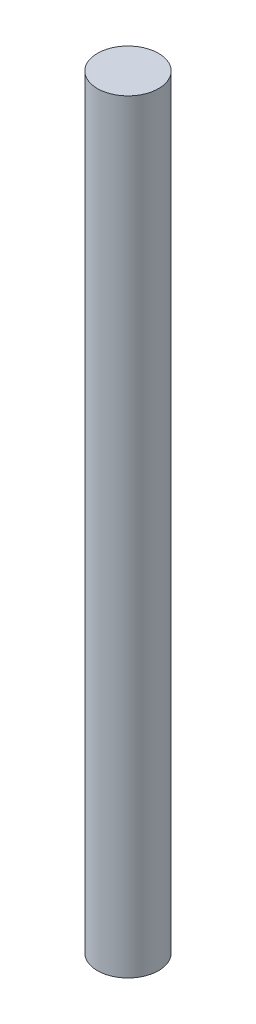
ISO-10303-21;
HEADER;
FILE_DESCRIPTION(('STEP AP214'),'2;1');
FILE_NAME('part.step','',(''),(''),'','','');
FILE_SCHEMA(('AUTOMOTIVE_DESIGN { 1 0 10303 214 1 1 1 1 }'));
ENDSEC;
DATA;
#1=APPLICATION_CONTEXT('core data for automotive mechanical design processes');
#2=APPLICATION_PROTOCOL_DEFINITION('international standard','automotive_design',2000,#1);
#3=PRODUCT_CONTEXT('',#1,'mechanical');
#4=PRODUCT('Part','Part','',(#3));
#5=PRODUCT_RELATED_PRODUCT_CATEGORY('part','',(#4));
#6=PRODUCT_DEFINITION_FORMATION('','',#4);
#7=PRODUCT_DEFINITION_CONTEXT('part definition',#1,'design');
#8=PRODUCT_DEFINITION('design','',#6,#7);
#9=PRODUCT_DEFINITION_SHAPE('','',#8);
#10=(LENGTH_UNIT() NAMED_UNIT(*) SI_UNIT(.MILLI.,.METRE.));
#11=(NAMED_UNIT(*) PLANE_ANGLE_UNIT() SI_UNIT($,.RADIAN.));
#12=(NAMED_UNIT(*) SI_UNIT($,.STERADIAN.) SOLID_ANGLE_UNIT());
#13=UNCERTAINTY_MEASURE_WITH_UNIT(LENGTH_MEASURE(1.E-05),#10,'distance_accuracy_value','');
#14=(GEOMETRIC_REPRESENTATION_CONTEXT(3) GLOBAL_UNCERTAINTY_ASSIGNED_CONTEXT((#13)) GLOBAL_UNIT_ASSIGNED_CONTEXT((#10,
#11,#12)) REPRESENTATION_CONTEXT('',''));
#15=CARTESIAN_POINT('',(0.,0.,0.));
#16=DIRECTION('',(0.,0.,1.));
#17=DIRECTION('',(1.,0.,0.));
#18=AXIS2_PLACEMENT_3D('',#15,#16,#17);
#19=CARTESIAN_POINT('',(0.,100.,0.));
#20=DIRECTION('',(0.,-1.,0.));
#21=DIRECTION('',(0.,0.,-1.));
#22=AXIS2_PLACEMENT_3D('',#19,#20,#21);
#23=CYLINDRICAL_SURFACE('',#22,4.);
#24=CARTESIAN_POINT('',(0.,100.,0.));
#25=DIRECTION('',(0.,1.,0.));
#26=DIRECTION('',(0.,0.,1.));
#27=AXIS2_PLACEMENT_3D('',#24,#25,#26);
#28=CIRCLE('',#27,4.);
#29=CARTESIAN_POINT('',(0.,100.,4.));
#30=VERTEX_POINT('',#29);
#31=EDGE_CURVE('E10',#30,#30,#28,.T.);
#32=ORIENTED_EDGE('',*,*,#31,.F.);
#33=EDGE_LOOP('',(#32));
#34=FACE_BOUND('',#33,.T.);
#35=CARTESIAN_POINT('',(0.,0.,0.));
#36=DIRECTION('',(0.,1.,0.));
#37=DIRECTION('',(0.,0.,1.));
#38=AXIS2_PLACEMENT_3D('',#35,#36,#37);
#39=CIRCLE('',#38,4.);
#40=CARTESIAN_POINT('',(0.,0.,4.));
#41=VERTEX_POINT('',#40);
#42=EDGE_CURVE('E52',#41,#41,#39,.T.);
#43=ORIENTED_EDGE('',*,*,#42,.T.);
#44=EDGE_LOOP('',(#43));
#45=FACE_BOUND('',#44,.T.);
#46=ADVANCED_FACE('F49',(#34,#45),#23,.T.);
#47=CARTESIAN_POINT('',(0.,100.,0.));
#48=DIRECTION('',(0.,1.,0.));
#49=DIRECTION('',(0.,0.,1.));
#50=AXIS2_PLACEMENT_3D('',#47,#48,#49);
#51=PLANE('',#50);
#52=ORIENTED_EDGE('',*,*,#31,.T.);
#53=EDGE_LOOP('',(#52));
#54=FACE_BOUND('',#53,.T.);
#55=ADVANCED_FACE('F66',(#54),#51,.T.);
#56=CARTESIAN_POINT('',(0.,0.,0.));
#57=DIRECTION('',(0.,1.,0.));
#58=DIRECTION('',(0.,0.,1.));
#59=AXIS2_PLACEMENT_3D('',#56,#57,#58);
#60=PLANE('',#59);
#61=ORIENTED_EDGE('',*,*,#42,.F.);
#62=EDGE_LOOP('',(#61));
#63=FACE_BOUND('',#62,.T.);
#64=ADVANCED_FACE('F64',(#63),#60,.F.);
#65=CLOSED_SHELL('',(#46,#55,#64));
#66=MANIFOLD_SOLID_BREP('B2',#65);
#67=ADVANCED_BREP_SHAPE_REPRESENTATION('',(#18,#66),#14);
#68=SHAPE_DEFINITION_REPRESENTATION(#9,#67);
ENDSEC;
END-ISO-10303-21;
